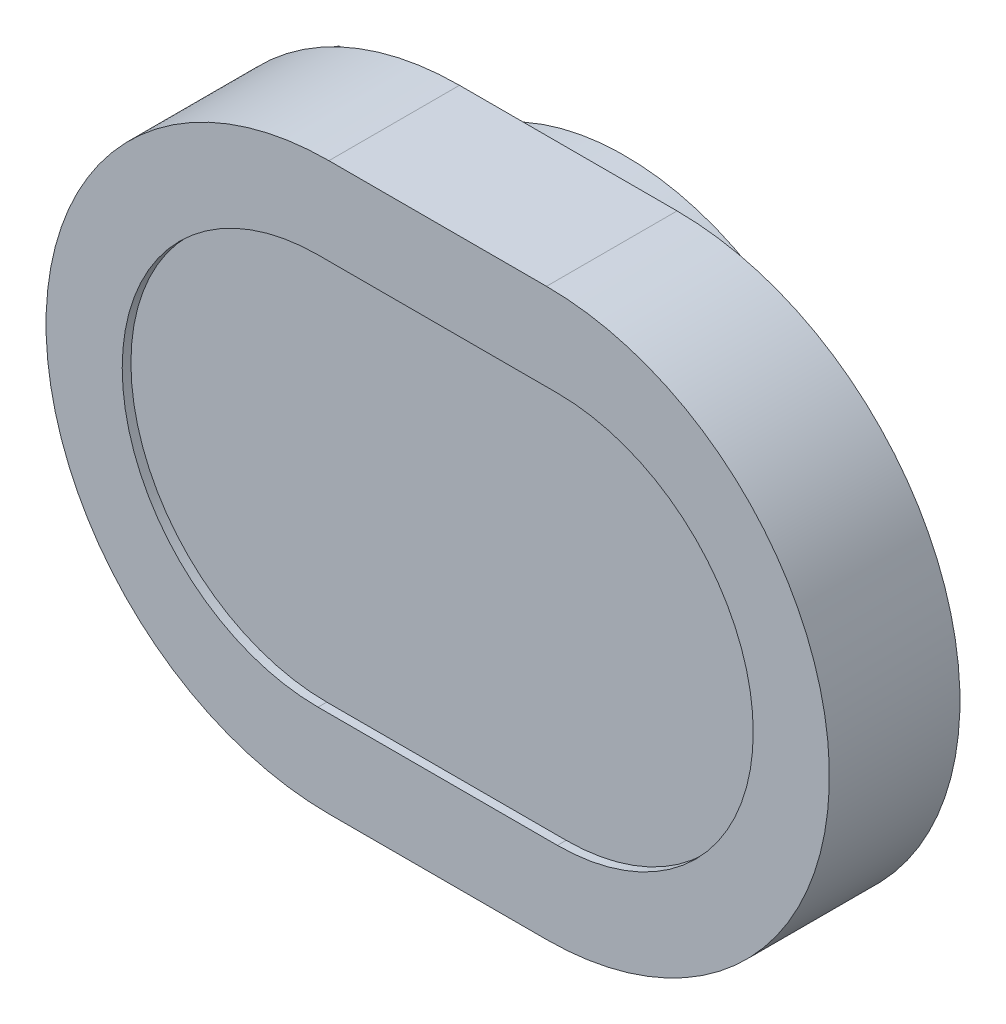
ISO-10303-21;
HEADER;
FILE_DESCRIPTION(('STEP AP214'),'2;1');
FILE_NAME('part.step','',(''),(''),'','','');
FILE_SCHEMA(('AUTOMOTIVE_DESIGN { 1 0 10303 214 1 1 1 1 }'));
ENDSEC;
DATA;
#1=APPLICATION_CONTEXT('core data for automotive mechanical design processes');
#2=APPLICATION_PROTOCOL_DEFINITION('international standard','automotive_design',2000,#1);
#3=PRODUCT_CONTEXT('',#1,'mechanical');
#4=PRODUCT('Part','Part','',(#3));
#5=PRODUCT_RELATED_PRODUCT_CATEGORY('part','',(#4));
#6=PRODUCT_DEFINITION_FORMATION('','',#4);
#7=PRODUCT_DEFINITION_CONTEXT('part definition',#1,'design');
#8=PRODUCT_DEFINITION('design','',#6,#7);
#9=PRODUCT_DEFINITION_SHAPE('','',#8);
#10=(LENGTH_UNIT() NAMED_UNIT(*) SI_UNIT(.MILLI.,.METRE.));
#11=(NAMED_UNIT(*) PLANE_ANGLE_UNIT() SI_UNIT($,.RADIAN.));
#12=(NAMED_UNIT(*) SI_UNIT($,.STERADIAN.) SOLID_ANGLE_UNIT());
#13=UNCERTAINTY_MEASURE_WITH_UNIT(LENGTH_MEASURE(1.E-05),#10,'distance_accuracy_value','');
#14=(GEOMETRIC_REPRESENTATION_CONTEXT(3) GLOBAL_UNCERTAINTY_ASSIGNED_CONTEXT((#13)) GLOBAL_UNIT_ASSIGNED_CONTEXT((#10,
#11,#12)) REPRESENTATION_CONTEXT('',''));
#15=CARTESIAN_POINT('',(0.,0.,0.));
#16=DIRECTION('',(0.,0.,1.));
#17=DIRECTION('',(1.,0.,0.));
#18=AXIS2_PLACEMENT_3D('',#15,#16,#17);
#19=CARTESIAN_POINT('',(-2.50000000000001,0.,1.3));
#20=DIRECTION('',(0.,0.,1.));
#21=DIRECTION('',(1.,0.,0.));
#22=AXIS2_PLACEMENT_3D('',#19,#20,#21);
#23=PLANE('',#22);
#24=CARTESIAN_POINT('',(0.,0.,1.3));
#25=DIRECTION('',(0.,0.,1.));
#26=DIRECTION('',(1.,0.,0.));
#27=AXIS2_PLACEMENT_3D('',#24,#25,#26);
#28=CIRCLE('',#27,5.91044294453824);
#29=CARTESIAN_POINT('',(-2.16410161513777,5.5,1.3));
#30=VERTEX_POINT('',#29);
#31=CARTESIAN_POINT('',(-5.35568257093733,2.5,1.3));
#32=VERTEX_POINT('',#31);
#33=EDGE_CURVE('E173',#30,#32,#28,.T.);
#34=ORIENTED_EDGE('',*,*,#33,.F.);
#35=DIRECTION('',(1.,0.,0.));
#36=VECTOR('',#35,1.);
#37=CARTESIAN_POINT('',(-5.66410161513777,5.5,1.3));
#38=LINE('',#37,#36);
#39=CARTESIAN_POINT('',(-5.66410161513777,5.5,1.3));
#40=VERTEX_POINT('',#39);
#41=EDGE_CURVE('E186',#40,#30,#38,.T.);
#42=ORIENTED_EDGE('',*,*,#41,.F.);
#43=CARTESIAN_POINT('',(-2.50000000000001,0.,1.3));
#44=DIRECTION('',(0.,0.,-1.));
#45=DIRECTION('',(-1.,0.,0.));
#46=AXIS2_PLACEMENT_3D('',#43,#44,#45);
#47=CIRCLE('',#46,6.34519810809066);
#48=CARTESIAN_POINT('',(-8.33194127464582,2.5,1.3));
#49=VERTEX_POINT('',#48);
#50=EDGE_CURVE('E195',#49,#40,#47,.T.);
#51=ORIENTED_EDGE('',*,*,#50,.F.);
#52=DIRECTION('',(-1.,0.,0.));
#53=VECTOR('',#52,1.);
#54=CARTESIAN_POINT('',(-5.35568257093733,2.5,1.3));
#55=LINE('',#54,#53);
#56=EDGE_CURVE('E176',#32,#49,#55,.T.);
#57=ORIENTED_EDGE('',*,*,#56,.F.);
#58=EDGE_LOOP('',(#34,#42,#51,#57));
#59=FACE_BOUND('',#58,.T.);
#60=CARTESIAN_POINT('',(0.,0.,1.3));
#61=DIRECTION('',(0.,0.,1.));
#62=DIRECTION('',(1.,0.,0.));
#63=AXIS2_PLACEMENT_3D('',#60,#61,#62);
#64=CIRCLE('',#63,5.7);
#65=CARTESIAN_POINT('',(5.7,0.,1.3));
#66=VERTEX_POINT('',#65);
#67=EDGE_CURVE('E11',#66,#66,#64,.T.);
#68=ORIENTED_EDGE('',*,*,#67,.T.);
#69=EDGE_LOOP('',(#68));
#70=FACE_BOUND('',#69,.T.);
#71=CARTESIAN_POINT('',(-2.50000000000001,0.,1.3));
#72=DIRECTION('',(0.,0.,1.));
#73=DIRECTION('',(1.,0.,0.));
#74=AXIS2_PLACEMENT_3D('',#71,#72,#73);
#75=CIRCLE('',#74,6.5);
#76=CARTESIAN_POINT('',(-2.50000000000001,6.5,1.3));
#77=VERTEX_POINT('',#76);
#78=CARTESIAN_POINT('',(-2.5,-6.5,1.3));
#79=VERTEX_POINT('',#78);
#80=EDGE_CURVE('E252',#77,#79,#75,.T.);
#81=ORIENTED_EDGE('',*,*,#80,.F.);
#82=DIRECTION('',(-1.,0.,0.));
#83=VECTOR('',#82,1.);
#84=CARTESIAN_POINT('',(-2.50000000000001,6.5,1.3));
#85=LINE('',#84,#83);
#86=CARTESIAN_POINT('',(2.50000000000001,6.5,1.3));
#87=VERTEX_POINT('',#86);
#88=EDGE_CURVE('E259',#87,#77,#85,.T.);
#89=ORIENTED_EDGE('',*,*,#88,.F.);
#90=CARTESIAN_POINT('',(2.50000000000001,0.,1.3));
#91=DIRECTION('',(0.,0.,1.));
#92=DIRECTION('',(1.,0.,0.));
#93=AXIS2_PLACEMENT_3D('',#90,#91,#92);
#94=CIRCLE('',#93,6.5);
#95=CARTESIAN_POINT('',(2.50000000000001,-6.5,1.3));
#96=VERTEX_POINT('',#95);
#97=EDGE_CURVE('E257',#96,#87,#94,.T.);
#98=ORIENTED_EDGE('',*,*,#97,.F.);
#99=DIRECTION('',(1.,0.,0.));
#100=VECTOR('',#99,1.);
#101=CARTESIAN_POINT('',(-2.5,-6.5,1.3));
#102=LINE('',#101,#100);
#103=EDGE_CURVE('E255',#79,#96,#102,.T.);
#104=ORIENTED_EDGE('',*,*,#103,.F.);
#105=EDGE_LOOP('',(#81,#89,#98,#104));
#106=FACE_BOUND('',#105,.T.);
#107=CARTESIAN_POINT('',(-2.50000000000001,0.,1.3));
#108=DIRECTION('',(0.,0.,-1.));
#109=DIRECTION('',(1.,0.,0.));
#110=AXIS2_PLACEMENT_3D('',#107,#108,#109);
#111=CIRCLE('',#110,6.34519810809067);
#112=CARTESIAN_POINT('',(-5.66410161513777,-5.49999999999999,1.3));
#113=VERTEX_POINT('',#112);
#114=CARTESIAN_POINT('',(-8.33194127464582,-2.5,1.3));
#115=VERTEX_POINT('',#114);
#116=EDGE_CURVE('E172',#113,#115,#111,.T.);
#117=ORIENTED_EDGE('',*,*,#116,.F.);
#118=DIRECTION('',(-1.,0.,0.));
#119=VECTOR('',#118,1.);
#120=CARTESIAN_POINT('',(-5.66410161513777,-5.49999999999999,1.3));
#121=LINE('',#120,#119);
#122=CARTESIAN_POINT('',(-2.16410161513779,-5.49999999999999,1.3));
#123=VERTEX_POINT('',#122);
#124=EDGE_CURVE('E169',#123,#113,#121,.T.);
#125=ORIENTED_EDGE('',*,*,#124,.F.);
#126=CARTESIAN_POINT('',(0.,0.,1.3));
#127=DIRECTION('',(0.,0.,1.));
#128=DIRECTION('',(1.,0.,0.));
#129=AXIS2_PLACEMENT_3D('',#126,#127,#128);
#130=CIRCLE('',#129,5.91044294453824);
#131=CARTESIAN_POINT('',(-5.35568257093733,-2.5,1.3));
#132=VERTEX_POINT('',#131);
#133=EDGE_CURVE('E59',#132,#123,#130,.T.);
#134=ORIENTED_EDGE('',*,*,#133,.F.);
#135=DIRECTION('',(1.,0.,0.));
#136=VECTOR('',#135,1.);
#137=CARTESIAN_POINT('',(-5.35568257093733,-2.5,1.3));
#138=LINE('',#137,#136);
#139=EDGE_CURVE('E54',#115,#132,#138,.T.);
#140=ORIENTED_EDGE('',*,*,#139,.F.);
#141=EDGE_LOOP('',(#117,#125,#134,#140));
#142=FACE_BOUND('',#141,.T.);
#143=ADVANCED_FACE('F39',(#59,#70,#106,#142),#23,.F.);
#144=CARTESIAN_POINT('',(0.,0.,1.3));
#145=DIRECTION('',(0.,0.,-1.));
#146=DIRECTION('',(-1.,0.,0.));
#147=AXIS2_PLACEMENT_3D('',#144,#145,#146);
#148=CYLINDRICAL_SURFACE('',#147,5.7);
#149=ORIENTED_EDGE('',*,*,#67,.F.);
#150=EDGE_LOOP('',(#149));
#151=FACE_BOUND('',#150,.T.);
#152=CARTESIAN_POINT('',(0.,0.,0.));
#153=DIRECTION('',(0.,0.,1.));
#154=DIRECTION('',(1.,0.,0.));
#155=AXIS2_PLACEMENT_3D('',#152,#153,#154);
#156=CIRCLE('',#155,5.7);
#157=CARTESIAN_POINT('',(5.7,0.,0.));
#158=VERTEX_POINT('',#157);
#159=EDGE_CURVE('E43',#158,#158,#156,.T.);
#160=ORIENTED_EDGE('',*,*,#159,.T.);
#161=EDGE_LOOP('',(#160));
#162=FACE_BOUND('',#161,.T.);
#163=ADVANCED_FACE('F41',(#151,#162),#148,.T.);
#164=CARTESIAN_POINT('',(0.,0.,0.));
#165=DIRECTION('',(0.,0.,1.));
#166=DIRECTION('',(1.,0.,0.));
#167=AXIS2_PLACEMENT_3D('',#164,#165,#166);
#168=PLANE('',#167);
#169=ORIENTED_EDGE('',*,*,#159,.F.);
#170=EDGE_LOOP('',(#169));
#171=FACE_BOUND('',#170,.T.);
#172=ADVANCED_FACE('F278',(#171),#168,.F.);
#173=CARTESIAN_POINT('',(-2.50000000000001,0.,4.1));
#174=DIRECTION('',(0.,0.,-1.));
#175=DIRECTION('',(-1.,0.,0.));
#176=AXIS2_PLACEMENT_3D('',#173,#174,#175);
#177=CYLINDRICAL_SURFACE('',#176,6.5);
#178=ORIENTED_EDGE('',*,*,#80,.T.);
#179=DIRECTION('',(0.,0.,-1.));
#180=VECTOR('',#179,1.);
#181=CARTESIAN_POINT('',(-2.5,-6.5,4.1));
#182=LINE('',#181,#180);
#183=CARTESIAN_POINT('',(-2.50000000000001,-6.5,4.3));
#184=VERTEX_POINT('',#183);
#185=EDGE_CURVE('E270',#184,#79,#182,.T.);
#186=ORIENTED_EDGE('',*,*,#185,.F.);
#187=CARTESIAN_POINT('',(-2.50000000000001,0.,4.3));
#188=DIRECTION('',(0.,0.,1.));
#189=DIRECTION('',(1.,0.,0.));
#190=AXIS2_PLACEMENT_3D('',#187,#188,#189);
#191=CIRCLE('',#190,6.5);
#192=CARTESIAN_POINT('',(-2.50000000000001,6.5,4.3));
#193=VERTEX_POINT('',#192);
#194=EDGE_CURVE('E240',#193,#184,#191,.T.);
#195=ORIENTED_EDGE('',*,*,#194,.F.);
#196=DIRECTION('',(0.,0.,-1.));
#197=VECTOR('',#196,1.);
#198=CARTESIAN_POINT('',(-2.50000000000001,6.5,4.1));
#199=LINE('',#198,#197);
#200=EDGE_CURVE('E261',#193,#77,#199,.T.);
#201=ORIENTED_EDGE('',*,*,#200,.T.);
#202=EDGE_LOOP('',(#178,#186,#195,#201));
#203=FACE_BOUND('',#202,.T.);
#204=ADVANCED_FACE('F280',(#203),#177,.T.);
#205=CARTESIAN_POINT('',(-2.5,-6.5,4.1));
#206=DIRECTION('',(0.,1.,0.));
#207=DIRECTION('',(0.,0.,1.));
#208=AXIS2_PLACEMENT_3D('',#205,#206,#207);
#209=PLANE('',#208);
#210=ORIENTED_EDGE('',*,*,#103,.T.);
#211=DIRECTION('',(0.,0.,-1.));
#212=VECTOR('',#211,1.);
#213=CARTESIAN_POINT('',(2.50000000000001,-6.5,4.1));
#214=LINE('',#213,#212);
#215=CARTESIAN_POINT('',(2.50000000000001,-6.5,4.3));
#216=VERTEX_POINT('',#215);
#217=EDGE_CURVE('E267',#216,#96,#214,.T.);
#218=ORIENTED_EDGE('',*,*,#217,.F.);
#219=DIRECTION('',(1.,0.,0.));
#220=VECTOR('',#219,1.);
#221=CARTESIAN_POINT('',(-2.50000000000001,-6.5,4.3));
#222=LINE('',#221,#220);
#223=EDGE_CURVE('E243',#184,#216,#222,.T.);
#224=ORIENTED_EDGE('',*,*,#223,.F.);
#225=ORIENTED_EDGE('',*,*,#185,.T.);
#226=EDGE_LOOP('',(#210,#218,#224,#225));
#227=FACE_BOUND('',#226,.T.);
#228=ADVANCED_FACE('F285',(#227),#209,.F.);
#229=CARTESIAN_POINT('',(2.50000000000001,0.,4.1));
#230=DIRECTION('',(0.,0.,-1.));
#231=DIRECTION('',(-1.,0.,0.));
#232=AXIS2_PLACEMENT_3D('',#229,#230,#231);
#233=CYLINDRICAL_SURFACE('',#232,6.5);
#234=ORIENTED_EDGE('',*,*,#97,.T.);
#235=DIRECTION('',(0.,0.,-1.));
#236=VECTOR('',#235,1.);
#237=CARTESIAN_POINT('',(2.50000000000001,6.5,4.1));
#238=LINE('',#237,#236);
#239=CARTESIAN_POINT('',(2.50000000000001,6.5,4.3));
#240=VERTEX_POINT('',#239);
#241=EDGE_CURVE('E264',#240,#87,#238,.T.);
#242=ORIENTED_EDGE('',*,*,#241,.F.);
#243=CARTESIAN_POINT('',(2.50000000000001,0.,4.3));
#244=DIRECTION('',(0.,0.,1.));
#245=DIRECTION('',(1.,0.,0.));
#246=AXIS2_PLACEMENT_3D('',#243,#244,#245);
#247=CIRCLE('',#246,6.5);
#248=EDGE_CURVE('E246',#216,#240,#247,.T.);
#249=ORIENTED_EDGE('',*,*,#248,.F.);
#250=ORIENTED_EDGE('',*,*,#217,.T.);
#251=EDGE_LOOP('',(#234,#242,#249,#250));
#252=FACE_BOUND('',#251,.T.);
#253=ADVANCED_FACE('F305',(#252),#233,.T.);
#254=CARTESIAN_POINT('',(-2.50000000000001,6.5,4.1));
#255=DIRECTION('',(0.,-1.,0.));
#256=DIRECTION('',(0.,0.,-1.));
#257=AXIS2_PLACEMENT_3D('',#254,#255,#256);
#258=PLANE('',#257);
#259=ORIENTED_EDGE('',*,*,#88,.T.);
#260=ORIENTED_EDGE('',*,*,#200,.F.);
#261=DIRECTION('',(-1.,0.,0.));
#262=VECTOR('',#261,1.);
#263=CARTESIAN_POINT('',(-2.50000000000001,6.5,4.3));
#264=LINE('',#263,#262);
#265=EDGE_CURVE('E249',#240,#193,#264,.T.);
#266=ORIENTED_EDGE('',*,*,#265,.F.);
#267=ORIENTED_EDGE('',*,*,#241,.T.);
#268=EDGE_LOOP('',(#259,#260,#266,#267));
#269=FACE_BOUND('',#268,.T.);
#270=ADVANCED_FACE('F301',(#269),#258,.F.);
#271=CARTESIAN_POINT('',(-2.50000000000001,0.,4.3));
#272=DIRECTION('',(0.,0.,1.));
#273=DIRECTION('',(1.,0.,0.));
#274=AXIS2_PLACEMENT_3D('',#271,#272,#273);
#275=PLANE('',#274);
#276=ORIENTED_EDGE('',*,*,#194,.T.);
#277=ORIENTED_EDGE('',*,*,#223,.T.);
#278=ORIENTED_EDGE('',*,*,#248,.T.);
#279=ORIENTED_EDGE('',*,*,#265,.T.);
#280=EDGE_LOOP('',(#276,#277,#278,#279));
#281=FACE_BOUND('',#280,.T.);
#282=DIRECTION('',(1.,0.,0.));
#283=VECTOR('',#282,1.);
#284=CARTESIAN_POINT('',(-2.75,-4.5,4.3));
#285=LINE('',#284,#283);
#286=CARTESIAN_POINT('',(-2.75,-4.5,4.3));
#287=VERTEX_POINT('',#286);
#288=CARTESIAN_POINT('',(2.75,-4.5,4.3));
#289=VERTEX_POINT('',#288);
#290=EDGE_CURVE('E214',#287,#289,#285,.T.);
#291=ORIENTED_EDGE('',*,*,#290,.F.);
#292=CARTESIAN_POINT('',(-2.75,0.,4.3));
#293=DIRECTION('',(0.,0.,1.));
#294=DIRECTION('',(1.,0.,0.));
#295=AXIS2_PLACEMENT_3D('',#292,#293,#294);
#296=CIRCLE('',#295,4.5);
#297=CARTESIAN_POINT('',(-2.75,4.5,4.3));
#298=VERTEX_POINT('',#297);
#299=EDGE_CURVE('E212',#298,#287,#296,.T.);
#300=ORIENTED_EDGE('',*,*,#299,.F.);
#301=DIRECTION('',(-1.,0.,0.));
#302=VECTOR('',#301,1.);
#303=CARTESIAN_POINT('',(-2.75,4.5,4.3));
#304=LINE('',#303,#302);
#305=CARTESIAN_POINT('',(2.75,4.5,4.3));
#306=VERTEX_POINT('',#305);
#307=EDGE_CURVE('E220',#306,#298,#304,.T.);
#308=ORIENTED_EDGE('',*,*,#307,.F.);
#309=CARTESIAN_POINT('',(2.75,0.,4.3));
#310=DIRECTION('',(0.,0.,1.));
#311=DIRECTION('',(1.,0.,0.));
#312=AXIS2_PLACEMENT_3D('',#309,#310,#311);
#313=CIRCLE('',#312,4.5);
#314=EDGE_CURVE('E217',#289,#306,#313,.T.);
#315=ORIENTED_EDGE('',*,*,#314,.F.);
#316=EDGE_LOOP('',(#291,#300,#308,#315));
#317=FACE_BOUND('',#316,.T.);
#318=ADVANCED_FACE('F304',(#281,#317),#275,.T.);
#319=CARTESIAN_POINT('',(-2.75,0.,4.3));
#320=DIRECTION('',(0.,0.,-1.));
#321=DIRECTION('',(-1.,0.,0.));
#322=AXIS2_PLACEMENT_3D('',#319,#320,#321);
#323=CYLINDRICAL_SURFACE('',#322,4.5);
#324=CARTESIAN_POINT('',(-2.75,0.,4.1));
#325=DIRECTION('',(0.,0.,1.));
#326=DIRECTION('',(1.,0.,0.));
#327=AXIS2_PLACEMENT_3D('',#324,#325,#326);
#328=CIRCLE('',#327,4.5);
#329=CARTESIAN_POINT('',(-2.75,4.5,4.1));
#330=VERTEX_POINT('',#329);
#331=CARTESIAN_POINT('',(-2.75,-4.5,4.1));
#332=VERTEX_POINT('',#331);
#333=EDGE_CURVE('E211',#330,#332,#328,.T.);
#334=ORIENTED_EDGE('',*,*,#333,.F.);
#335=DIRECTION('',(0.,0.,-1.));
#336=VECTOR('',#335,1.);
#337=CARTESIAN_POINT('',(-2.75,4.5,4.3));
#338=LINE('',#337,#336);
#339=EDGE_CURVE('E222',#298,#330,#338,.T.);
#340=ORIENTED_EDGE('',*,*,#339,.F.);
#341=ORIENTED_EDGE('',*,*,#299,.T.);
#342=DIRECTION('',(0.,0.,-1.));
#343=VECTOR('',#342,1.);
#344=CARTESIAN_POINT('',(-2.75,-4.5,4.3));
#345=LINE('',#344,#343);
#346=EDGE_CURVE('E237',#287,#332,#345,.T.);
#347=ORIENTED_EDGE('',*,*,#346,.T.);
#348=EDGE_LOOP('',(#334,#340,#341,#347));
#349=FACE_BOUND('',#348,.T.);
#350=ADVANCED_FACE('F323',(#349),#323,.F.);
#351=CARTESIAN_POINT('',(-2.75,-4.5,4.3));
#352=DIRECTION('',(0.,1.,0.));
#353=DIRECTION('',(0.,0.,1.));
#354=AXIS2_PLACEMENT_3D('',#351,#352,#353);
#355=PLANE('',#354);
#356=DIRECTION('',(1.,0.,0.));
#357=VECTOR('',#356,1.);
#358=CARTESIAN_POINT('',(-2.75,-4.5,4.1));
#359=LINE('',#358,#357);
#360=CARTESIAN_POINT('',(2.75,-4.5,4.1));
#361=VERTEX_POINT('',#360);
#362=EDGE_CURVE('E224',#332,#361,#359,.T.);
#363=ORIENTED_EDGE('',*,*,#362,.F.);
#364=ORIENTED_EDGE('',*,*,#346,.F.);
#365=ORIENTED_EDGE('',*,*,#290,.T.);
#366=DIRECTION('',(0.,0.,-1.));
#367=VECTOR('',#366,1.);
#368=CARTESIAN_POINT('',(2.75,-4.5,4.3));
#369=LINE('',#368,#367);
#370=EDGE_CURVE('E234',#289,#361,#369,.T.);
#371=ORIENTED_EDGE('',*,*,#370,.T.);
#372=EDGE_LOOP('',(#363,#364,#365,#371));
#373=FACE_BOUND('',#372,.T.);
#374=ADVANCED_FACE('F332',(#373),#355,.T.);
#375=CARTESIAN_POINT('',(2.75,0.,4.3));
#376=DIRECTION('',(0.,0.,-1.));
#377=DIRECTION('',(-1.,0.,0.));
#378=AXIS2_PLACEMENT_3D('',#375,#376,#377);
#379=CYLINDRICAL_SURFACE('',#378,4.5);
#380=CARTESIAN_POINT('',(2.75,0.,4.1));
#381=DIRECTION('',(0.,0.,1.));
#382=DIRECTION('',(1.,0.,0.));
#383=AXIS2_PLACEMENT_3D('',#380,#381,#382);
#384=CIRCLE('',#383,4.5);
#385=CARTESIAN_POINT('',(2.75,4.5,4.1));
#386=VERTEX_POINT('',#385);
#387=EDGE_CURVE('E226',#361,#386,#384,.T.);
#388=ORIENTED_EDGE('',*,*,#387,.F.);
#389=ORIENTED_EDGE('',*,*,#370,.F.);
#390=ORIENTED_EDGE('',*,*,#314,.T.);
#391=DIRECTION('',(0.,0.,-1.));
#392=VECTOR('',#391,1.);
#393=CARTESIAN_POINT('',(2.75,4.5,4.3));
#394=LINE('',#393,#392);
#395=EDGE_CURVE('E231',#306,#386,#394,.T.);
#396=ORIENTED_EDGE('',*,*,#395,.T.);
#397=EDGE_LOOP('',(#388,#389,#390,#396));
#398=FACE_BOUND('',#397,.T.);
#399=ADVANCED_FACE('F335',(#398),#379,.F.);
#400=CARTESIAN_POINT('',(-2.75,4.5,4.3));
#401=DIRECTION('',(0.,-1.,0.));
#402=DIRECTION('',(0.,0.,-1.));
#403=AXIS2_PLACEMENT_3D('',#400,#401,#402);
#404=PLANE('',#403);
#405=DIRECTION('',(-1.,0.,0.));
#406=VECTOR('',#405,1.);
#407=CARTESIAN_POINT('',(-2.75,4.5,4.1));
#408=LINE('',#407,#406);
#409=EDGE_CURVE('E215',#386,#330,#408,.T.);
#410=ORIENTED_EDGE('',*,*,#409,.F.);
#411=ORIENTED_EDGE('',*,*,#395,.F.);
#412=ORIENTED_EDGE('',*,*,#307,.T.);
#413=ORIENTED_EDGE('',*,*,#339,.T.);
#414=EDGE_LOOP('',(#410,#411,#412,#413));
#415=FACE_BOUND('',#414,.T.);
#416=ADVANCED_FACE('F342',(#415),#404,.T.);
#417=CARTESIAN_POINT('',(-2.50000000000001,0.,4.1));
#418=DIRECTION('',(0.,0.,1.));
#419=DIRECTION('',(1.,0.,0.));
#420=AXIS2_PLACEMENT_3D('',#417,#418,#419);
#421=PLANE('',#420);
#422=ORIENTED_EDGE('',*,*,#333,.T.);
#423=ORIENTED_EDGE('',*,*,#362,.T.);
#424=ORIENTED_EDGE('',*,*,#387,.T.);
#425=ORIENTED_EDGE('',*,*,#409,.T.);
#426=EDGE_LOOP('',(#422,#423,#424,#425));
#427=FACE_BOUND('',#426,.T.);
#428=ADVANCED_FACE('F299',(#427),#421,.T.);
#429=CARTESIAN_POINT('',(0.,0.,0.9));
#430=DIRECTION('',(0.,0.,1.));
#431=DIRECTION('',(1.,0.,0.));
#432=AXIS2_PLACEMENT_3D('',#429,#430,#431);
#433=CYLINDRICAL_SURFACE('',#432,5.91044294453824);
#434=ORIENTED_EDGE('',*,*,#33,.T.);
#435=DIRECTION('',(0.,0.,1.));
#436=VECTOR('',#435,1.);
#437=CARTESIAN_POINT('',(-5.35568257093733,2.5,0.9));
#438=LINE('',#437,#436);
#439=CARTESIAN_POINT('',(-5.35568257093733,2.5,0.9));
#440=VERTEX_POINT('',#439);
#441=EDGE_CURVE('E208',#440,#32,#438,.T.);
#442=ORIENTED_EDGE('',*,*,#441,.F.);
#443=CARTESIAN_POINT('',(0.,0.,0.9));
#444=DIRECTION('',(0.,0.,1.));
#445=DIRECTION('',(1.,0.,0.));
#446=AXIS2_PLACEMENT_3D('',#443,#444,#445);
#447=CIRCLE('',#446,5.91044294453824);
#448=CARTESIAN_POINT('',(-2.16410161513777,5.5,0.9));
#449=VERTEX_POINT('',#448);
#450=EDGE_CURVE('E182',#449,#440,#447,.T.);
#451=ORIENTED_EDGE('',*,*,#450,.F.);
#452=DIRECTION('',(0.,0.,1.));
#453=VECTOR('',#452,1.);
#454=CARTESIAN_POINT('',(-2.16410161513777,5.5,0.9));
#455=LINE('',#454,#453);
#456=EDGE_CURVE('E191',#449,#30,#455,.T.);
#457=ORIENTED_EDGE('',*,*,#456,.T.);
#458=EDGE_LOOP('',(#434,#442,#451,#457));
#459=FACE_BOUND('',#458,.T.);
#460=ADVANCED_FACE('F349',(#459),#433,.F.);
#461=CARTESIAN_POINT('',(-5.35568257093733,2.5,0.9));
#462=DIRECTION('',(0.,1.,0.));
#463=DIRECTION('',(-1.,0.,0.));
#464=AXIS2_PLACEMENT_3D('',#461,#462,#463);
#465=PLANE('',#464);
#466=ORIENTED_EDGE('',*,*,#56,.T.);
#467=DIRECTION('',(0.,0.,1.));
#468=VECTOR('',#467,1.);
#469=CARTESIAN_POINT('',(-8.33194127464582,2.5,0.9));
#470=LINE('',#469,#468);
#471=CARTESIAN_POINT('',(-8.33194127464582,2.5,0.9));
#472=VERTEX_POINT('',#471);
#473=EDGE_CURVE('E205',#472,#49,#470,.T.);
#474=ORIENTED_EDGE('',*,*,#473,.F.);
#475=DIRECTION('',(-1.,0.,0.));
#476=VECTOR('',#475,1.);
#477=CARTESIAN_POINT('',(-5.35568257093733,2.5,0.9));
#478=LINE('',#477,#476);
#479=EDGE_CURVE('E185',#440,#472,#478,.T.);
#480=ORIENTED_EDGE('',*,*,#479,.F.);
#481=ORIENTED_EDGE('',*,*,#441,.T.);
#482=EDGE_LOOP('',(#466,#474,#480,#481));
#483=FACE_BOUND('',#482,.T.);
#484=ADVANCED_FACE('F392',(#483),#465,.F.);
#485=CARTESIAN_POINT('',(-2.50000000000001,0.,0.9));
#486=DIRECTION('',(0.,0.,1.));
#487=DIRECTION('',(1.,0.,0.));
#488=AXIS2_PLACEMENT_3D('',#485,#486,#487);
#489=CYLINDRICAL_SURFACE('',#488,6.34519810809066);
#490=ORIENTED_EDGE('',*,*,#50,.T.);
#491=DIRECTION('',(0.,0.,1.));
#492=VECTOR('',#491,1.);
#493=CARTESIAN_POINT('',(-5.66410161513777,5.5,0.9));
#494=LINE('',#493,#492);
#495=CARTESIAN_POINT('',(-5.66410161513777,5.5,0.9));
#496=VERTEX_POINT('',#495);
#497=EDGE_CURVE('E202',#496,#40,#494,.T.);
#498=ORIENTED_EDGE('',*,*,#497,.F.);
#499=CARTESIAN_POINT('',(-2.50000000000001,0.,0.9));
#500=DIRECTION('',(0.,0.,-1.));
#501=DIRECTION('',(-1.,0.,0.));
#502=AXIS2_PLACEMENT_3D('',#499,#500,#501);
#503=CIRCLE('',#502,6.34519810809066);
#504=EDGE_CURVE('E188',#472,#496,#503,.T.);
#505=ORIENTED_EDGE('',*,*,#504,.F.);
#506=ORIENTED_EDGE('',*,*,#473,.T.);
#507=EDGE_LOOP('',(#490,#498,#505,#506));
#508=FACE_BOUND('',#507,.T.);
#509=ADVANCED_FACE('F398',(#508),#489,.T.);
#510=CARTESIAN_POINT('',(-5.66410161513777,5.5,0.9));
#511=DIRECTION('',(0.,-1.,0.));
#512=DIRECTION('',(1.,0.,0.));
#513=AXIS2_PLACEMENT_3D('',#510,#511,#512);
#514=PLANE('',#513);
#515=ORIENTED_EDGE('',*,*,#41,.T.);
#516=ORIENTED_EDGE('',*,*,#456,.F.);
#517=DIRECTION('',(1.,0.,0.));
#518=VECTOR('',#517,1.);
#519=CARTESIAN_POINT('',(-5.66410161513777,5.5,0.9));
#520=LINE('',#519,#518);
#521=EDGE_CURVE('E190',#496,#449,#520,.T.);
#522=ORIENTED_EDGE('',*,*,#521,.F.);
#523=ORIENTED_EDGE('',*,*,#497,.T.);
#524=EDGE_LOOP('',(#515,#516,#522,#523));
#525=FACE_BOUND('',#524,.T.);
#526=ADVANCED_FACE('F405',(#525),#514,.F.);
#527=CARTESIAN_POINT('',(0.,0.,0.9));
#528=DIRECTION('',(0.,0.,1.));
#529=DIRECTION('',(1.,0.,0.));
#530=AXIS2_PLACEMENT_3D('',#527,#528,#529);
#531=PLANE('',#530);
#532=ORIENTED_EDGE('',*,*,#450,.T.);
#533=ORIENTED_EDGE('',*,*,#479,.T.);
#534=ORIENTED_EDGE('',*,*,#504,.T.);
#535=ORIENTED_EDGE('',*,*,#521,.T.);
#536=EDGE_LOOP('',(#532,#533,#534,#535));
#537=FACE_BOUND('',#536,.T.);
#538=ADVANCED_FACE('F413',(#537),#531,.F.);
#539=CARTESIAN_POINT('',(-2.50000000000001,0.,0.9));
#540=DIRECTION('',(0.,0.,1.));
#541=DIRECTION('',(1.,0.,0.));
#542=AXIS2_PLACEMENT_3D('',#539,#540,#541);
#543=CYLINDRICAL_SURFACE('',#542,6.34519810809067);
#544=ORIENTED_EDGE('',*,*,#116,.T.);
#545=DIRECTION('',(0.,0.,1.));
#546=VECTOR('',#545,1.);
#547=CARTESIAN_POINT('',(-8.33194127464582,-2.5,0.9));
#548=LINE('',#547,#546);
#549=CARTESIAN_POINT('',(-8.33194127464582,-2.5,0.9));
#550=VERTEX_POINT('',#549);
#551=EDGE_CURVE('E153',#550,#115,#548,.T.);
#552=ORIENTED_EDGE('',*,*,#551,.F.);
#553=CARTESIAN_POINT('',(-2.50000000000001,0.,0.9));
#554=DIRECTION('',(0.,0.,-1.));
#555=DIRECTION('',(1.,0.,0.));
#556=AXIS2_PLACEMENT_3D('',#553,#554,#555);
#557=CIRCLE('',#556,6.34519810809067);
#558=CARTESIAN_POINT('',(-5.66410161513777,-5.49999999999999,0.9));
#559=VERTEX_POINT('',#558);
#560=EDGE_CURVE('E160',#559,#550,#557,.T.);
#561=ORIENTED_EDGE('',*,*,#560,.F.);
#562=DIRECTION('',(0.,0.,1.));
#563=VECTOR('',#562,1.);
#564=CARTESIAN_POINT('',(-5.66410161513777,-5.49999999999999,0.9));
#565=LINE('',#564,#563);
#566=EDGE_CURVE('E480',#559,#113,#565,.T.);
#567=ORIENTED_EDGE('',*,*,#566,.T.);
#568=EDGE_LOOP('',(#544,#552,#561,#567));
#569=FACE_BOUND('',#568,.T.);
#570=ADVANCED_FACE('F171',(#569),#543,.T.);
#571=CARTESIAN_POINT('',(-5.35568257093733,-2.5,0.9));
#572=DIRECTION('',(0.,-1.,0.));
#573=DIRECTION('',(0.,0.,-1.));
#574=AXIS2_PLACEMENT_3D('',#571,#572,#573);
#575=PLANE('',#574);
#576=ORIENTED_EDGE('',*,*,#139,.T.);
#577=DIRECTION('',(0.,0.,1.));
#578=VECTOR('',#577,1.);
#579=CARTESIAN_POINT('',(-5.35568257093733,-2.5,0.9));
#580=LINE('',#579,#578);
#581=CARTESIAN_POINT('',(-5.35568257093733,-2.5,0.9));
#582=VERTEX_POINT('',#581);
#583=EDGE_CURVE('E156',#582,#132,#580,.T.);
#584=ORIENTED_EDGE('',*,*,#583,.F.);
#585=DIRECTION('',(1.,0.,0.));
#586=VECTOR('',#585,1.);
#587=CARTESIAN_POINT('',(-5.35568257093733,-2.5,0.9));
#588=LINE('',#587,#586);
#589=EDGE_CURVE('E149',#550,#582,#588,.T.);
#590=ORIENTED_EDGE('',*,*,#589,.F.);
#591=ORIENTED_EDGE('',*,*,#551,.T.);
#592=EDGE_LOOP('',(#576,#584,#590,#591));
#593=FACE_BOUND('',#592,.T.);
#594=ADVANCED_FACE('F151',(#593),#575,.F.);
#595=CARTESIAN_POINT('',(0.,0.,0.9));
#596=DIRECTION('',(0.,0.,1.));
#597=DIRECTION('',(1.,0.,0.));
#598=AXIS2_PLACEMENT_3D('',#595,#596,#597);
#599=CYLINDRICAL_SURFACE('',#598,5.91044294453824);
#600=ORIENTED_EDGE('',*,*,#133,.T.);
#601=DIRECTION('',(0.,0.,1.));
#602=VECTOR('',#601,1.);
#603=CARTESIAN_POINT('',(-2.16410161513779,-5.49999999999999,0.9));
#604=LINE('',#603,#602);
#605=CARTESIAN_POINT('',(-2.16410161513779,-5.49999999999999,0.9));
#606=VERTEX_POINT('',#605);
#607=EDGE_CURVE('E178',#606,#123,#604,.T.);
#608=ORIENTED_EDGE('',*,*,#607,.F.);
#609=CARTESIAN_POINT('',(0.,0.,0.9));
#610=DIRECTION('',(0.,0.,1.));
#611=DIRECTION('',(1.,0.,0.));
#612=AXIS2_PLACEMENT_3D('',#609,#610,#611);
#613=CIRCLE('',#612,5.91044294453824);
#614=EDGE_CURVE('E159',#582,#606,#613,.T.);
#615=ORIENTED_EDGE('',*,*,#614,.F.);
#616=ORIENTED_EDGE('',*,*,#583,.T.);
#617=EDGE_LOOP('',(#600,#608,#615,#616));
#618=FACE_BOUND('',#617,.T.);
#619=ADVANCED_FACE('F434',(#618),#599,.F.);
#620=CARTESIAN_POINT('',(-5.66410161513777,-5.49999999999999,0.9));
#621=DIRECTION('',(0.,1.,0.));
#622=DIRECTION('',(-1.,0.,0.));
#623=AXIS2_PLACEMENT_3D('',#620,#621,#622);
#624=PLANE('',#623);
#625=ORIENTED_EDGE('',*,*,#124,.T.);
#626=ORIENTED_EDGE('',*,*,#566,.F.);
#627=DIRECTION('',(-1.,0.,0.));
#628=VECTOR('',#627,1.);
#629=CARTESIAN_POINT('',(-5.66410161513777,-5.49999999999999,0.9));
#630=LINE('',#629,#628);
#631=EDGE_CURVE('E165',#606,#559,#630,.T.);
#632=ORIENTED_EDGE('',*,*,#631,.F.);
#633=ORIENTED_EDGE('',*,*,#607,.T.);
#634=EDGE_LOOP('',(#625,#626,#632,#633));
#635=FACE_BOUND('',#634,.T.);
#636=ADVANCED_FACE('F441',(#635),#624,.F.);
#637=CARTESIAN_POINT('',(-2.50000000000001,0.,0.9));
#638=DIRECTION('',(0.,0.,1.));
#639=DIRECTION('',(1.,0.,0.));
#640=AXIS2_PLACEMENT_3D('',#637,#638,#639);
#641=PLANE('',#640);
#642=ORIENTED_EDGE('',*,*,#560,.T.);
#643=ORIENTED_EDGE('',*,*,#589,.T.);
#644=ORIENTED_EDGE('',*,*,#614,.T.);
#645=ORIENTED_EDGE('',*,*,#631,.T.);
#646=EDGE_LOOP('',(#642,#643,#644,#645));
#647=FACE_BOUND('',#646,.T.);
#648=ADVANCED_FACE('F163',(#647),#641,.F.);
#649=CLOSED_SHELL('',(#143,#163,#172,#204,#228,#253,#270,#318,#350,#374,#399,#416,#428,#460,
#484,#509,#526,#538,#570,#594,#619,#636,#648));
#650=MANIFOLD_SOLID_BREP('B2',#649);
#651=ADVANCED_BREP_SHAPE_REPRESENTATION('',(#18,#650),#14);
#652=SHAPE_DEFINITION_REPRESENTATION(#9,#651);
ENDSEC;
END-ISO-10303-21;
